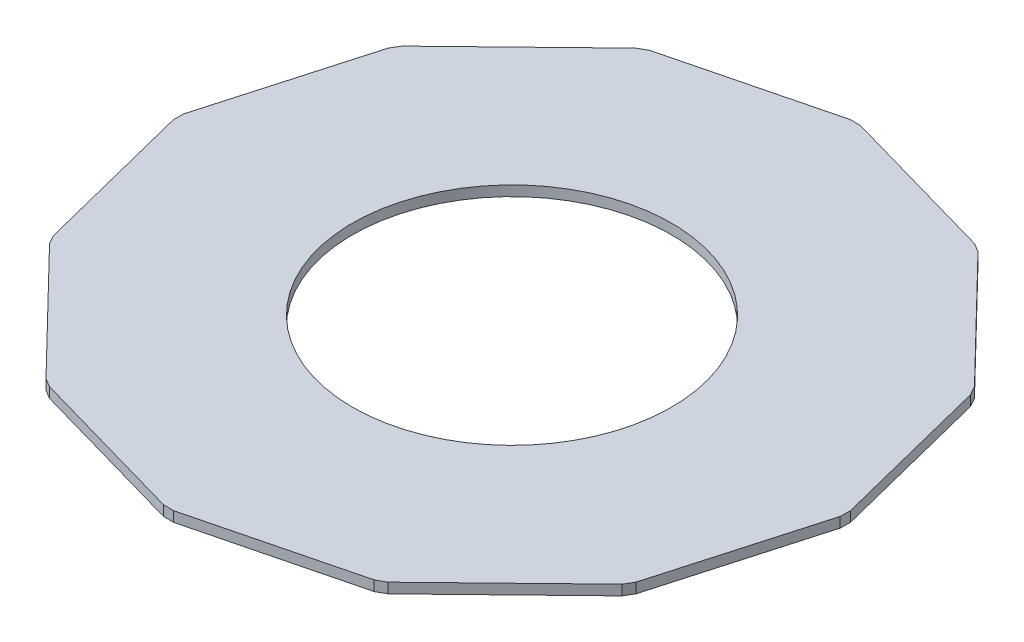
ISO-10303-21;
HEADER;
FILE_DESCRIPTION(('STEP AP214'),'2;1');
FILE_NAME('part.step','',(''),(''),'','','');
FILE_SCHEMA(('AUTOMOTIVE_DESIGN { 1 0 10303 214 1 1 1 1 }'));
ENDSEC;
DATA;
#1=APPLICATION_CONTEXT('core data for automotive mechanical design processes');
#2=APPLICATION_PROTOCOL_DEFINITION('international standard','automotive_design',2000,#1);
#3=PRODUCT_CONTEXT('',#1,'mechanical');
#4=PRODUCT('Part','Part','',(#3));
#5=PRODUCT_RELATED_PRODUCT_CATEGORY('part','',(#4));
#6=PRODUCT_DEFINITION_FORMATION('','',#4);
#7=PRODUCT_DEFINITION_CONTEXT('part definition',#1,'design');
#8=PRODUCT_DEFINITION('design','',#6,#7);
#9=PRODUCT_DEFINITION_SHAPE('','',#8);
#10=(LENGTH_UNIT() NAMED_UNIT(*) SI_UNIT(.MILLI.,.METRE.));
#11=(NAMED_UNIT(*) PLANE_ANGLE_UNIT() SI_UNIT($,.RADIAN.));
#12=(NAMED_UNIT(*) SI_UNIT($,.STERADIAN.) SOLID_ANGLE_UNIT());
#13=UNCERTAINTY_MEASURE_WITH_UNIT(LENGTH_MEASURE(1.E-05),#10,'distance_accuracy_value','');
#14=(GEOMETRIC_REPRESENTATION_CONTEXT(3) GLOBAL_UNCERTAINTY_ASSIGNED_CONTEXT((#13)) GLOBAL_UNIT_ASSIGNED_CONTEXT((#10,
#11,#12)) REPRESENTATION_CONTEXT('',''));
#15=CARTESIAN_POINT('',(0.,0.,0.));
#16=DIRECTION('',(0.,0.,1.));
#17=DIRECTION('',(1.,0.,0.));
#18=AXIS2_PLACEMENT_3D('',#15,#16,#17);
#19=CARTESIAN_POINT('',(0.,3.,0.));
#20=DIRECTION('',(0.,-1.,0.));
#21=DIRECTION('',(0.,0.,-1.));
#22=AXIS2_PLACEMENT_3D('',#19,#20,#21);
#23=PLANE('',#22);
#24=DIRECTION('',(0.4868656215294,0.,0.873476883822801));
#25=VECTOR('',#24,1.);
#26=CARTESIAN_POINT('',(-86.6075627822344,3.,49.9912999323014));
#27=LINE('',#26,#25);
#28=CARTESIAN_POINT('',(-88.0681596468219,3.,47.3708692808343));
#29=VERTEX_POINT('',#28);
#30=CARTESIAN_POINT('',(-86.6075627822344,3.,49.9912999323014));
#31=VERTEX_POINT('',#30);
#32=EDGE_CURVE('E336',#29,#31,#27,.T.);
#33=ORIENTED_EDGE('',*,*,#32,.T.);
#34=DIRECTION('',(0.696348530757659,0.,0.717703785493465));
#35=VECTOR('',#34,1.);
#36=CARTESIAN_POINT('',(-52.5838288782753,3.,85.0584560199646));
#37=LINE('',#36,#35);
#38=CARTESIAN_POINT('',(-52.5838288782753,3.,85.0584560199646));
#39=VERTEX_POINT('',#38);
#40=EDGE_CURVE('E168',#31,#39,#37,.T.);
#41=ORIENTED_EDGE('',*,*,#40,.T.);
#42=DIRECTION('',(0.858376438385156,0.,0.513020360244323));
#43=VECTOR('',#42,1.);
#44=CARTESIAN_POINT('',(-50.0086995631199,3.,86.5975171006976));
#45=LINE('',#44,#43);
#46=CARTESIAN_POINT('',(-50.0086995631199,3.,86.5975171006976));
#47=VERTEX_POINT('',#46);
#48=EDGE_CURVE('E413',#39,#47,#45,.T.);
#49=ORIENTED_EDGE('',*,*,#48,.T.);
#50=DIRECTION('',(0.961907410270835,0.,0.273375445250767));
#51=VECTOR('',#50,1.);
#52=CARTESIAN_POINT('',(-3.00970362685779,3.,99.9546981591085));
#53=LINE('',#52,#51);
#54=CARTESIAN_POINT('',(-3.00970362685779,3.,99.9546981591085));
#55=VERTEX_POINT('',#54);
#56=EDGE_CURVE('E433',#47,#55,#53,.T.);
#57=ORIENTED_EDGE('',*,*,#56,.T.);
#58=DIRECTION('',(0.999885981773714,0.,0.0151004454376491));
#59=VECTOR('',#58,1.);
#60=CARTESIAN_POINT('',(-0.0100456815366456,3.,99.9999994954214));
#61=LINE('',#60,#59);
#62=CARTESIAN_POINT('',(-0.0100456815366456,3.,99.9999994954214));
#63=VERTEX_POINT('',#62);
#64=EDGE_CURVE('E429',#55,#63,#61,.T.);
#65=ORIENTED_EDGE('',*,*,#64,.T.);
#66=DIRECTION('',(0.969723976008427,0.,-0.244203624777373));
#67=VECTOR('',#66,1.);
#68=CARTESIAN_POINT('',(47.3708692808333,3.,88.0681596468224));
#69=LINE('',#68,#67);
#70=CARTESIAN_POINT('',(47.3708692808333,3.,88.0681596468224));
#71=VERTEX_POINT('',#70);
#72=EDGE_CURVE('E432',#63,#71,#69,.T.);
#73=ORIENTED_EDGE('',*,*,#72,.T.);
#74=DIRECTION('',(0.873476883822806,0.,-0.486865621529392));
#75=VECTOR('',#74,1.);
#76=CARTESIAN_POINT('',(49.9912999323017,3.,86.6075627822342));
#77=LINE('',#76,#75);
#78=CARTESIAN_POINT('',(49.9912999323017,3.,86.6075627822342));
#79=VERTEX_POINT('',#78);
#80=EDGE_CURVE('E436',#71,#79,#77,.T.);
#81=ORIENTED_EDGE('',*,*,#80,.T.);
#82=DIRECTION('',(0.717703785493462,0.,-0.696348530757662));
#83=VECTOR('',#82,1.);
#84=CARTESIAN_POINT('',(85.0584560199648,3.,52.583828878275));
#85=LINE('',#84,#83);
#86=CARTESIAN_POINT('',(85.0584560199648,3.,52.583828878275));
#87=VERTEX_POINT('',#86);
#88=EDGE_CURVE('E444',#79,#87,#85,.T.);
#89=ORIENTED_EDGE('',*,*,#88,.T.);
#90=DIRECTION('',(0.513020360244322,0.,-0.858376438385156));
#91=VECTOR('',#90,1.);
#92=CARTESIAN_POINT('',(86.5975171006978,3.,50.0086995631196));
#93=LINE('',#92,#91);
#94=CARTESIAN_POINT('',(86.5975171006978,3.,50.0086995631196));
#95=VERTEX_POINT('',#94);
#96=EDGE_CURVE('E447',#87,#95,#93,.T.);
#97=ORIENTED_EDGE('',*,*,#96,.T.);
#98=DIRECTION('',(0.273375445250764,0.,-0.961907410270836));
#99=VECTOR('',#98,1.);
#100=CARTESIAN_POINT('',(99.9546981591085,3.,3.00970362685742));
#101=LINE('',#100,#99);
#102=CARTESIAN_POINT('',(99.9546981591085,3.,3.00970362685742));
#103=VERTEX_POINT('',#102);
#104=EDGE_CURVE('E450',#95,#103,#101,.T.);
#105=ORIENTED_EDGE('',*,*,#104,.T.);
#106=DIRECTION('',(0.0151004454376491,0.,-0.999885981773714));
#107=VECTOR('',#106,1.);
#108=CARTESIAN_POINT('',(99.9999994954214,3.,0.0100456815362756));
#109=LINE('',#108,#107);
#110=CARTESIAN_POINT('',(99.9999994954214,3.,0.0100456815362756));
#111=VERTEX_POINT('',#110);
#112=EDGE_CURVE('E453',#103,#111,#109,.T.);
#113=ORIENTED_EDGE('',*,*,#112,.T.);
#114=DIRECTION('',(-0.244203624777376,0.,-0.969723976008426));
#115=VECTOR('',#114,1.);
#116=CARTESIAN_POINT('',(88.0681596468223,3.,-47.3708692808336));
#117=LINE('',#116,#115);
#118=CARTESIAN_POINT('',(88.0681596468223,3.,-47.3708692808336));
#119=VERTEX_POINT('',#118);
#120=EDGE_CURVE('E455',#111,#119,#117,.T.);
#121=ORIENTED_EDGE('',*,*,#120,.T.);
#122=DIRECTION('',(-0.486865621529395,0.,-0.873476883822804));
#123=VECTOR('',#122,1.);
#124=CARTESIAN_POINT('',(86.6075627822341,3.,-49.991299932302));
#125=LINE('',#124,#123);
#126=CARTESIAN_POINT('',(86.6075627822341,3.,-49.991299932302));
#127=VERTEX_POINT('',#126);
#128=EDGE_CURVE('E458',#119,#127,#125,.T.);
#129=ORIENTED_EDGE('',*,*,#128,.T.);
#130=DIRECTION('',(-0.696348530757664,0.,-0.71770378549346));
#131=VECTOR('',#130,1.);
#132=CARTESIAN_POINT('',(52.5838288782748,3.,-85.058456019965));
#133=LINE('',#132,#131);
#134=CARTESIAN_POINT('',(52.5838288782748,3.,-85.058456019965));
#135=VERTEX_POINT('',#134);
#136=EDGE_CURVE('E461',#127,#135,#133,.T.);
#137=ORIENTED_EDGE('',*,*,#136,.T.);
#138=DIRECTION('',(-0.858376438385159,0.,-0.513020360244318));
#139=VECTOR('',#138,1.);
#140=CARTESIAN_POINT('',(50.0086995631193,3.,-86.597517100698));
#141=LINE('',#140,#139);
#142=CARTESIAN_POINT('',(50.0086995631193,3.,-86.597517100698));
#143=VERTEX_POINT('',#142);
#144=EDGE_CURVE('E464',#135,#143,#141,.T.);
#145=ORIENTED_EDGE('',*,*,#144,.T.);
#146=DIRECTION('',(-0.961907410270837,0.,-0.27337544525076));
#147=VECTOR('',#146,1.);
#148=CARTESIAN_POINT('',(3.00970362685709,3.,-99.9546981591085));
#149=LINE('',#148,#147);
#150=CARTESIAN_POINT('',(3.00970362685709,3.,-99.9546981591085));
#151=VERTEX_POINT('',#150);
#152=EDGE_CURVE('E466',#143,#151,#149,.T.);
#153=ORIENTED_EDGE('',*,*,#152,.T.);
#154=DIRECTION('',(-0.999885981773714,0.,-0.0151004454376445));
#155=VECTOR('',#154,1.);
#156=CARTESIAN_POINT('',(0.0100456815359403,3.,-99.9999994954214));
#157=LINE('',#156,#155);
#158=CARTESIAN_POINT('',(0.0100456815359403,3.,-99.9999994954214));
#159=VERTEX_POINT('',#158);
#160=EDGE_CURVE('E469',#151,#159,#157,.T.);
#161=ORIENTED_EDGE('',*,*,#160,.T.);
#162=DIRECTION('',(-0.969723976008425,0.,0.244203624777379));
#163=VECTOR('',#162,1.);
#164=CARTESIAN_POINT('',(-47.3708692808339,3.,-88.0681596468221));
#165=LINE('',#164,#163);
#166=CARTESIAN_POINT('',(-47.3708692808339,3.,-88.0681596468221));
#167=VERTEX_POINT('',#166);
#168=EDGE_CURVE('E472',#159,#167,#165,.T.);
#169=ORIENTED_EDGE('',*,*,#168,.T.);
#170=DIRECTION('',(-0.873476883822803,0.,0.486865621529396));
#171=VECTOR('',#170,1.);
#172=CARTESIAN_POINT('',(-49.9912999323023,3.,-86.6075627822339));
#173=LINE('',#172,#171);
#174=CARTESIAN_POINT('',(-49.9912999323023,3.,-86.6075627822339));
#175=VERTEX_POINT('',#174);
#176=EDGE_CURVE('E475',#167,#175,#173,.T.);
#177=ORIENTED_EDGE('',*,*,#176,.T.);
#178=DIRECTION('',(-0.717703785493457,0.,0.696348530757667));
#179=VECTOR('',#178,1.);
#180=CARTESIAN_POINT('',(-85.0584560199652,3.,-52.5838288782744));
#181=LINE('',#180,#179);
#182=CARTESIAN_POINT('',(-85.0584560199652,3.,-52.5838288782744));
#183=VERTEX_POINT('',#182);
#184=EDGE_CURVE('E478',#175,#183,#181,.T.);
#185=ORIENTED_EDGE('',*,*,#184,.T.);
#186=DIRECTION('',(-0.513020360244315,0.,0.858376438385161));
#187=VECTOR('',#186,1.);
#188=CARTESIAN_POINT('',(-86.5975171006981,3.,-50.008699563119));
#189=LINE('',#188,#187);
#190=CARTESIAN_POINT('',(-86.5975171006981,3.,-50.008699563119));
#191=VERTEX_POINT('',#190);
#192=EDGE_CURVE('E250',#183,#191,#189,.T.);
#193=ORIENTED_EDGE('',*,*,#192,.T.);
#194=DIRECTION('',(-0.273375445250757,0.,0.961907410270838));
#195=VECTOR('',#194,1.);
#196=CARTESIAN_POINT('',(-99.9546981591085,3.,-3.00970362685674));
#197=LINE('',#196,#195);
#198=CARTESIAN_POINT('',(-99.9546981591085,3.,-3.00970362685674));
#199=VERTEX_POINT('',#198);
#200=EDGE_CURVE('E244',#191,#199,#197,.T.);
#201=ORIENTED_EDGE('',*,*,#200,.T.);
#202=DIRECTION('',(-0.0151004454376398,0.,0.999885981773714));
#203=VECTOR('',#202,1.);
#204=CARTESIAN_POINT('',(-99.9999994954214,3.,-0.0100456815355912));
#205=LINE('',#204,#203);
#206=CARTESIAN_POINT('',(-99.9999994954214,3.,-0.0100456815355912));
#207=VERTEX_POINT('',#206);
#208=EDGE_CURVE('E248',#199,#207,#205,.T.);
#209=ORIENTED_EDGE('',*,*,#208,.T.);
#210=DIRECTION('',(0.244203624777383,0.,0.969723976008425));
#211=VECTOR('',#210,1.);
#212=CARTESIAN_POINT('',(-88.0681596468219,3.,47.3708692808343));
#213=LINE('',#212,#211);
#214=EDGE_CURVE('E65',#207,#29,#213,.T.);
#215=ORIENTED_EDGE('',*,*,#214,.T.);
#216=EDGE_LOOP('',(#33,#41,#49,#57,#65,#73,#81,#89,#97,#105,#113,#121,#129,#137,#145,#153,#161,
#169,#177,#185,#193,#201,#209,#215));
#217=FACE_BOUND('',#216,.T.);
#218=CARTESIAN_POINT('',(0.,3.,0.));
#219=DIRECTION('',(0.,1.,0.));
#220=DIRECTION('',(0.,0.,1.));
#221=AXIS2_PLACEMENT_3D('',#218,#219,#220);
#222=CIRCLE('',#221,47.1167133191298);
#223=CARTESIAN_POINT('',(0.,3.,47.1167133191298));
#224=VERTEX_POINT('',#223);
#225=EDGE_CURVE('E276',#224,#224,#222,.T.);
#226=ORIENTED_EDGE('',*,*,#225,.F.);
#227=EDGE_LOOP('',(#226));
#228=FACE_BOUND('',#227,.T.);
#229=ADVANCED_FACE('F48',(#217,#228),#23,.F.);
#230=CARTESIAN_POINT('',(0.,0.,0.));
#231=DIRECTION('',(0.,-1.,0.));
#232=DIRECTION('',(0.,0.,-1.));
#233=AXIS2_PLACEMENT_3D('',#230,#231,#232);
#234=PLANE('',#233);
#235=DIRECTION('',(0.4868656215294,0.,0.873476883822801));
#236=VECTOR('',#235,1.);
#237=CARTESIAN_POINT('',(-86.6075627822344,0.,49.9912999323014));
#238=LINE('',#237,#236);
#239=CARTESIAN_POINT('',(-88.0681596468219,0.,47.3708692808343));
#240=VERTEX_POINT('',#239);
#241=CARTESIAN_POINT('',(-86.6075627822344,0.,49.9912999323014));
#242=VERTEX_POINT('',#241);
#243=EDGE_CURVE('E272',#240,#242,#238,.T.);
#244=ORIENTED_EDGE('',*,*,#243,.F.);
#245=DIRECTION('',(0.244203624777383,0.,0.969723976008425));
#246=VECTOR('',#245,1.);
#247=CARTESIAN_POINT('',(-88.0681596468219,0.,47.3708692808343));
#248=LINE('',#247,#246);
#249=CARTESIAN_POINT('',(-99.9999994954214,0.,-0.0100456815355912));
#250=VERTEX_POINT('',#249);
#251=EDGE_CURVE('E160',#250,#240,#248,.T.);
#252=ORIENTED_EDGE('',*,*,#251,.F.);
#253=DIRECTION('',(-0.0151004454376398,0.,0.999885981773714));
#254=VECTOR('',#253,1.);
#255=CARTESIAN_POINT('',(-99.9999994954214,0.,-0.0100456815355912));
#256=LINE('',#255,#254);
#257=CARTESIAN_POINT('',(-99.9546981591085,0.,-3.00970362685674));
#258=VERTEX_POINT('',#257);
#259=EDGE_CURVE('E154',#258,#250,#256,.T.);
#260=ORIENTED_EDGE('',*,*,#259,.F.);
#261=DIRECTION('',(-0.273375445250757,0.,0.961907410270838));
#262=VECTOR('',#261,1.);
#263=CARTESIAN_POINT('',(-99.9546981591085,0.,-3.00970362685674));
#264=LINE('',#263,#262);
#265=CARTESIAN_POINT('',(-86.5975171006981,0.,-50.008699563119));
#266=VERTEX_POINT('',#265);
#267=EDGE_CURVE('E259',#266,#258,#264,.T.);
#268=ORIENTED_EDGE('',*,*,#267,.F.);
#269=DIRECTION('',(-0.513020360244315,0.,0.858376438385161));
#270=VECTOR('',#269,1.);
#271=CARTESIAN_POINT('',(-86.5975171006981,0.,-50.008699563119));
#272=LINE('',#271,#270);
#273=CARTESIAN_POINT('',(-85.0584560199652,0.,-52.5838288782744));
#274=VERTEX_POINT('',#273);
#275=EDGE_CURVE('E330',#274,#266,#272,.T.);
#276=ORIENTED_EDGE('',*,*,#275,.F.);
#277=DIRECTION('',(-0.717703785493457,0.,0.696348530757667));
#278=VECTOR('',#277,1.);
#279=CARTESIAN_POINT('',(-85.0584560199652,0.,-52.5838288782744));
#280=LINE('',#279,#278);
#281=CARTESIAN_POINT('',(-49.9912999323023,0.,-86.6075627822339));
#282=VERTEX_POINT('',#281);
#283=EDGE_CURVE('E327',#282,#274,#280,.T.);
#284=ORIENTED_EDGE('',*,*,#283,.F.);
#285=DIRECTION('',(-0.873476883822803,0.,0.486865621529396));
#286=VECTOR('',#285,1.);
#287=CARTESIAN_POINT('',(-49.9912999323023,0.,-86.6075627822339));
#288=LINE('',#287,#286);
#289=CARTESIAN_POINT('',(-47.3708692808339,0.,-88.0681596468221));
#290=VERTEX_POINT('',#289);
#291=EDGE_CURVE('E324',#290,#282,#288,.T.);
#292=ORIENTED_EDGE('',*,*,#291,.F.);
#293=DIRECTION('',(-0.969723976008425,0.,0.244203624777379));
#294=VECTOR('',#293,1.);
#295=CARTESIAN_POINT('',(-47.3708692808339,0.,-88.0681596468221));
#296=LINE('',#295,#294);
#297=CARTESIAN_POINT('',(0.0100456815359403,0.,-99.9999994954214));
#298=VERTEX_POINT('',#297);
#299=EDGE_CURVE('E321',#298,#290,#296,.T.);
#300=ORIENTED_EDGE('',*,*,#299,.F.);
#301=DIRECTION('',(-0.999885981773714,0.,-0.0151004454376445));
#302=VECTOR('',#301,1.);
#303=CARTESIAN_POINT('',(0.0100456815359403,0.,-99.9999994954214));
#304=LINE('',#303,#302);
#305=CARTESIAN_POINT('',(3.00970362685709,0.,-99.9546981591085));
#306=VERTEX_POINT('',#305);
#307=EDGE_CURVE('E318',#306,#298,#304,.T.);
#308=ORIENTED_EDGE('',*,*,#307,.F.);
#309=DIRECTION('',(-0.961907410270837,0.,-0.27337544525076));
#310=VECTOR('',#309,1.);
#311=CARTESIAN_POINT('',(3.00970362685709,0.,-99.9546981591085));
#312=LINE('',#311,#310);
#313=CARTESIAN_POINT('',(50.0086995631193,0.,-86.597517100698));
#314=VERTEX_POINT('',#313);
#315=EDGE_CURVE('E315',#314,#306,#312,.T.);
#316=ORIENTED_EDGE('',*,*,#315,.F.);
#317=DIRECTION('',(-0.858376438385159,0.,-0.513020360244318));
#318=VECTOR('',#317,1.);
#319=CARTESIAN_POINT('',(50.0086995631193,0.,-86.597517100698));
#320=LINE('',#319,#318);
#321=CARTESIAN_POINT('',(52.5838288782748,0.,-85.058456019965));
#322=VERTEX_POINT('',#321);
#323=EDGE_CURVE('E313',#322,#314,#320,.T.);
#324=ORIENTED_EDGE('',*,*,#323,.F.);
#325=DIRECTION('',(-0.696348530757664,0.,-0.71770378549346));
#326=VECTOR('',#325,1.);
#327=CARTESIAN_POINT('',(52.5838288782748,0.,-85.058456019965));
#328=LINE('',#327,#326);
#329=CARTESIAN_POINT('',(86.6075627822341,0.,-49.991299932302));
#330=VERTEX_POINT('',#329);
#331=EDGE_CURVE('E310',#330,#322,#328,.T.);
#332=ORIENTED_EDGE('',*,*,#331,.F.);
#333=DIRECTION('',(-0.486865621529395,0.,-0.873476883822804));
#334=VECTOR('',#333,1.);
#335=CARTESIAN_POINT('',(86.6075627822341,0.,-49.991299932302));
#336=LINE('',#335,#334);
#337=CARTESIAN_POINT('',(88.0681596468223,0.,-47.3708692808336));
#338=VERTEX_POINT('',#337);
#339=EDGE_CURVE('E307',#338,#330,#336,.T.);
#340=ORIENTED_EDGE('',*,*,#339,.F.);
#341=DIRECTION('',(-0.244203624777376,0.,-0.969723976008426));
#342=VECTOR('',#341,1.);
#343=CARTESIAN_POINT('',(88.0681596468223,0.,-47.3708692808336));
#344=LINE('',#343,#342);
#345=CARTESIAN_POINT('',(99.9999994954214,0.,0.0100456815362756));
#346=VERTEX_POINT('',#345);
#347=EDGE_CURVE('E304',#346,#338,#344,.T.);
#348=ORIENTED_EDGE('',*,*,#347,.F.);
#349=DIRECTION('',(0.0151004454376491,0.,-0.999885981773714));
#350=VECTOR('',#349,1.);
#351=CARTESIAN_POINT('',(99.9999994954214,0.,0.0100456815362756));
#352=LINE('',#351,#350);
#353=CARTESIAN_POINT('',(99.9546981591085,0.,3.00970362685742));
#354=VERTEX_POINT('',#353);
#355=EDGE_CURVE('E302',#354,#346,#352,.T.);
#356=ORIENTED_EDGE('',*,*,#355,.F.);
#357=DIRECTION('',(0.273375445250764,0.,-0.961907410270836));
#358=VECTOR('',#357,1.);
#359=CARTESIAN_POINT('',(99.9546981591085,0.,3.00970362685742));
#360=LINE('',#359,#358);
#361=CARTESIAN_POINT('',(86.5975171006978,0.,50.0086995631196));
#362=VERTEX_POINT('',#361);
#363=EDGE_CURVE('E299',#362,#354,#360,.T.);
#364=ORIENTED_EDGE('',*,*,#363,.F.);
#365=DIRECTION('',(0.513020360244322,0.,-0.858376438385156));
#366=VECTOR('',#365,1.);
#367=CARTESIAN_POINT('',(86.5975171006978,0.,50.0086995631196));
#368=LINE('',#367,#366);
#369=CARTESIAN_POINT('',(85.0584560199648,0.,52.583828878275));
#370=VERTEX_POINT('',#369);
#371=EDGE_CURVE('E296',#370,#362,#368,.T.);
#372=ORIENTED_EDGE('',*,*,#371,.F.);
#373=DIRECTION('',(0.717703785493462,0.,-0.696348530757662));
#374=VECTOR('',#373,1.);
#375=CARTESIAN_POINT('',(85.0584560199648,0.,52.583828878275));
#376=LINE('',#375,#374);
#377=CARTESIAN_POINT('',(49.9912999323017,0.,86.6075627822342));
#378=VERTEX_POINT('',#377);
#379=EDGE_CURVE('E293',#378,#370,#376,.T.);
#380=ORIENTED_EDGE('',*,*,#379,.F.);
#381=DIRECTION('',(0.873476883822806,0.,-0.486865621529392));
#382=VECTOR('',#381,1.);
#383=CARTESIAN_POINT('',(49.9912999323017,0.,86.6075627822342));
#384=LINE('',#383,#382);
#385=CARTESIAN_POINT('',(47.3708692808333,0.,88.0681596468224));
#386=VERTEX_POINT('',#385);
#387=EDGE_CURVE('E290',#386,#378,#384,.T.);
#388=ORIENTED_EDGE('',*,*,#387,.F.);
#389=DIRECTION('',(0.969723976008427,0.,-0.244203624777373));
#390=VECTOR('',#389,1.);
#391=CARTESIAN_POINT('',(47.3708692808333,0.,88.0681596468224));
#392=LINE('',#391,#390);
#393=CARTESIAN_POINT('',(-0.0100456815366456,0.,99.9999994954214));
#394=VERTEX_POINT('',#393);
#395=EDGE_CURVE('E287',#394,#386,#392,.T.);
#396=ORIENTED_EDGE('',*,*,#395,.F.);
#397=DIRECTION('',(0.999885981773714,0.,0.0151004454376491));
#398=VECTOR('',#397,1.);
#399=CARTESIAN_POINT('',(-0.0100456815366456,0.,99.9999994954214));
#400=LINE('',#399,#398);
#401=CARTESIAN_POINT('',(-3.00970362685779,0.,99.9546981591085));
#402=VERTEX_POINT('',#401);
#403=EDGE_CURVE('E284',#402,#394,#400,.T.);
#404=ORIENTED_EDGE('',*,*,#403,.F.);
#405=DIRECTION('',(0.961907410270835,0.,0.273375445250767));
#406=VECTOR('',#405,1.);
#407=CARTESIAN_POINT('',(-3.00970362685779,0.,99.9546981591085));
#408=LINE('',#407,#406);
#409=CARTESIAN_POINT('',(-50.0086995631199,0.,86.5975171006976));
#410=VERTEX_POINT('',#409);
#411=EDGE_CURVE('E281',#410,#402,#408,.T.);
#412=ORIENTED_EDGE('',*,*,#411,.F.);
#413=DIRECTION('',(0.858376438385156,0.,0.513020360244323));
#414=VECTOR('',#413,1.);
#415=CARTESIAN_POINT('',(-50.0086995631199,0.,86.5975171006976));
#416=LINE('',#415,#414);
#417=CARTESIAN_POINT('',(-52.5838288782753,0.,85.0584560199646));
#418=VERTEX_POINT('',#417);
#419=EDGE_CURVE('E279',#418,#410,#416,.T.);
#420=ORIENTED_EDGE('',*,*,#419,.F.);
#421=DIRECTION('',(0.696348530757659,0.,0.717703785493465));
#422=VECTOR('',#421,1.);
#423=CARTESIAN_POINT('',(-52.5838288782753,0.,85.0584560199646));
#424=LINE('',#423,#422);
#425=EDGE_CURVE('E275',#242,#418,#424,.T.);
#426=ORIENTED_EDGE('',*,*,#425,.F.);
#427=EDGE_LOOP('',(#244,#252,#260,#268,#276,#284,#292,#300,#308,#316,#324,#332,#340,#348,#356,
#364,#372,#380,#388,#396,#404,#412,#420,#426));
#428=FACE_BOUND('',#427,.T.);
#429=CARTESIAN_POINT('',(0.,0.,0.));
#430=DIRECTION('',(0.,1.,0.));
#431=DIRECTION('',(0.,0.,1.));
#432=AXIS2_PLACEMENT_3D('',#429,#430,#431);
#433=CIRCLE('',#432,47.1167133191298);
#434=CARTESIAN_POINT('',(0.,0.,47.1167133191298));
#435=VERTEX_POINT('',#434);
#436=EDGE_CURVE('E791',#435,#435,#433,.T.);
#437=ORIENTED_EDGE('',*,*,#436,.T.);
#438=EDGE_LOOP('',(#437));
#439=FACE_BOUND('',#438,.T.);
#440=ADVANCED_FACE('F417',(#428,#439),#234,.T.);
#441=CARTESIAN_POINT('',(-86.6075627822344,3.,49.9912999323014));
#442=DIRECTION('',(0.873476883822801,0.,-0.4868656215294));
#443=DIRECTION('',(-0.4868656215294,0.,-0.873476883822801));
#444=AXIS2_PLACEMENT_3D('',#441,#442,#443);
#445=PLANE('',#444);
#446=ORIENTED_EDGE('',*,*,#243,.T.);
#447=DIRECTION('',(0.,-1.,0.));
#448=VECTOR('',#447,1.);
#449=CARTESIAN_POINT('',(-86.6075627822344,3.,49.9912999323014));
#450=LINE('',#449,#448);
#451=EDGE_CURVE('E13',#31,#242,#450,.T.);
#452=ORIENTED_EDGE('',*,*,#451,.F.);
#453=ORIENTED_EDGE('',*,*,#32,.F.);
#454=DIRECTION('',(0.,-1.,0.));
#455=VECTOR('',#454,1.);
#456=CARTESIAN_POINT('',(-88.0681596468219,3.,47.3708692808343));
#457=LINE('',#456,#455);
#458=EDGE_CURVE('E268',#29,#240,#457,.T.);
#459=ORIENTED_EDGE('',*,*,#458,.T.);
#460=EDGE_LOOP('',(#446,#452,#453,#459));
#461=FACE_BOUND('',#460,.T.);
#462=ADVANCED_FACE('F50',(#461),#445,.F.);
#463=CARTESIAN_POINT('',(-52.5838288782753,3.,85.0584560199646));
#464=DIRECTION('',(0.717703785493465,0.,-0.696348530757659));
#465=DIRECTION('',(-0.696348530757659,0.,-0.717703785493465));
#466=AXIS2_PLACEMENT_3D('',#463,#464,#465);
#467=PLANE('',#466);
#468=ORIENTED_EDGE('',*,*,#425,.T.);
#469=DIRECTION('',(0.,-1.,0.));
#470=VECTOR('',#469,1.);
#471=CARTESIAN_POINT('',(-52.5838288782753,3.,85.0584560199646));
#472=LINE('',#471,#470);
#473=EDGE_CURVE('E57',#39,#418,#472,.T.);
#474=ORIENTED_EDGE('',*,*,#473,.F.);
#475=ORIENTED_EDGE('',*,*,#40,.F.);
#476=ORIENTED_EDGE('',*,*,#451,.T.);
#477=EDGE_LOOP('',(#468,#474,#475,#476));
#478=FACE_BOUND('',#477,.T.);
#479=ADVANCED_FACE('F513',(#478),#467,.F.);
#480=CARTESIAN_POINT('',(-50.0086995631199,3.,86.5975171006976));
#481=DIRECTION('',(0.513020360244323,0.,-0.858376438385156));
#482=DIRECTION('',(-0.858376438385156,0.,-0.513020360244323));
#483=AXIS2_PLACEMENT_3D('',#480,#481,#482);
#484=PLANE('',#483);
#485=ORIENTED_EDGE('',*,*,#419,.T.);
#486=DIRECTION('',(0.,-1.,0.));
#487=VECTOR('',#486,1.);
#488=CARTESIAN_POINT('',(-50.0086995631199,3.,86.5975171006976));
#489=LINE('',#488,#487);
#490=EDGE_CURVE('E403',#47,#410,#489,.T.);
#491=ORIENTED_EDGE('',*,*,#490,.F.);
#492=ORIENTED_EDGE('',*,*,#48,.F.);
#493=ORIENTED_EDGE('',*,*,#473,.T.);
#494=EDGE_LOOP('',(#485,#491,#492,#493));
#495=FACE_BOUND('',#494,.T.);
#496=ADVANCED_FACE('F411',(#495),#484,.F.);
#497=CARTESIAN_POINT('',(-3.00970362685779,3.,99.9546981591085));
#498=DIRECTION('',(0.273375445250767,0.,-0.961907410270835));
#499=DIRECTION('',(-0.961907410270835,0.,-0.273375445250767));
#500=AXIS2_PLACEMENT_3D('',#497,#498,#499);
#501=PLANE('',#500);
#502=ORIENTED_EDGE('',*,*,#411,.T.);
#503=DIRECTION('',(0.,-1.,0.));
#504=VECTOR('',#503,1.);
#505=CARTESIAN_POINT('',(-3.00970362685779,3.,99.9546981591085));
#506=LINE('',#505,#504);
#507=EDGE_CURVE('E399',#55,#402,#506,.T.);
#508=ORIENTED_EDGE('',*,*,#507,.F.);
#509=ORIENTED_EDGE('',*,*,#56,.F.);
#510=ORIENTED_EDGE('',*,*,#490,.T.);
#511=EDGE_LOOP('',(#502,#508,#509,#510));
#512=FACE_BOUND('',#511,.T.);
#513=ADVANCED_FACE('F423',(#512),#501,.F.);
#514=CARTESIAN_POINT('',(-0.0100456815366456,3.,99.9999994954214));
#515=DIRECTION('',(0.0151004454376491,0.,-0.999885981773714));
#516=DIRECTION('',(-0.999885981773714,0.,-0.0151004454376491));
#517=AXIS2_PLACEMENT_3D('',#514,#515,#516);
#518=PLANE('',#517);
#519=ORIENTED_EDGE('',*,*,#403,.T.);
#520=DIRECTION('',(0.,-1.,0.));
#521=VECTOR('',#520,1.);
#522=CARTESIAN_POINT('',(-0.0100456815366456,3.,99.9999994954214));
#523=LINE('',#522,#521);
#524=EDGE_CURVE('E395',#63,#394,#523,.T.);
#525=ORIENTED_EDGE('',*,*,#524,.F.);
#526=ORIENTED_EDGE('',*,*,#64,.F.);
#527=ORIENTED_EDGE('',*,*,#507,.T.);
#528=EDGE_LOOP('',(#519,#525,#526,#527));
#529=FACE_BOUND('',#528,.T.);
#530=ADVANCED_FACE('F427',(#529),#518,.F.);
#531=CARTESIAN_POINT('',(47.3708692808333,3.,88.0681596468224));
#532=DIRECTION('',(-0.244203624777373,0.,-0.969723976008427));
#533=DIRECTION('',(-0.969723976008427,0.,0.244203624777373));
#534=AXIS2_PLACEMENT_3D('',#531,#532,#533);
#535=PLANE('',#534);
#536=ORIENTED_EDGE('',*,*,#395,.T.);
#537=DIRECTION('',(0.,-1.,0.));
#538=VECTOR('',#537,1.);
#539=CARTESIAN_POINT('',(47.3708692808333,3.,88.0681596468224));
#540=LINE('',#539,#538);
#541=EDGE_CURVE('E391',#71,#386,#540,.T.);
#542=ORIENTED_EDGE('',*,*,#541,.F.);
#543=ORIENTED_EDGE('',*,*,#72,.F.);
#544=ORIENTED_EDGE('',*,*,#524,.T.);
#545=EDGE_LOOP('',(#536,#542,#543,#544));
#546=FACE_BOUND('',#545,.T.);
#547=ADVANCED_FACE('F526',(#546),#535,.F.);
#548=CARTESIAN_POINT('',(49.9912999323017,3.,86.6075627822342));
#549=DIRECTION('',(-0.486865621529392,0.,-0.873476883822806));
#550=DIRECTION('',(-0.873476883822806,0.,0.486865621529392));
#551=AXIS2_PLACEMENT_3D('',#548,#549,#550);
#552=PLANE('',#551);
#553=ORIENTED_EDGE('',*,*,#387,.T.);
#554=DIRECTION('',(0.,-1.,0.));
#555=VECTOR('',#554,1.);
#556=CARTESIAN_POINT('',(49.9912999323017,3.,86.6075627822342));
#557=LINE('',#556,#555);
#558=EDGE_CURVE('E387',#79,#378,#557,.T.);
#559=ORIENTED_EDGE('',*,*,#558,.F.);
#560=ORIENTED_EDGE('',*,*,#80,.F.);
#561=ORIENTED_EDGE('',*,*,#541,.T.);
#562=EDGE_LOOP('',(#553,#559,#560,#561));
#563=FACE_BOUND('',#562,.T.);
#564=ADVANCED_FACE('F529',(#563),#552,.F.);
#565=CARTESIAN_POINT('',(85.0584560199648,3.,52.583828878275));
#566=DIRECTION('',(-0.696348530757662,0.,-0.717703785493462));
#567=DIRECTION('',(-0.717703785493462,0.,0.696348530757662));
#568=AXIS2_PLACEMENT_3D('',#565,#566,#567);
#569=PLANE('',#568);
#570=ORIENTED_EDGE('',*,*,#379,.T.);
#571=DIRECTION('',(0.,-1.,0.));
#572=VECTOR('',#571,1.);
#573=CARTESIAN_POINT('',(85.0584560199648,3.,52.583828878275));
#574=LINE('',#573,#572);
#575=EDGE_CURVE('E383',#87,#370,#574,.T.);
#576=ORIENTED_EDGE('',*,*,#575,.F.);
#577=ORIENTED_EDGE('',*,*,#88,.F.);
#578=ORIENTED_EDGE('',*,*,#558,.T.);
#579=EDGE_LOOP('',(#570,#576,#577,#578));
#580=FACE_BOUND('',#579,.T.);
#581=ADVANCED_FACE('F533',(#580),#569,.F.);
#582=CARTESIAN_POINT('',(86.5975171006978,3.,50.0086995631196));
#583=DIRECTION('',(-0.858376438385156,0.,-0.513020360244322));
#584=DIRECTION('',(-0.513020360244322,0.,0.858376438385156));
#585=AXIS2_PLACEMENT_3D('',#582,#583,#584);
#586=PLANE('',#585);
#587=ORIENTED_EDGE('',*,*,#371,.T.);
#588=DIRECTION('',(0.,-1.,0.));
#589=VECTOR('',#588,1.);
#590=CARTESIAN_POINT('',(86.5975171006978,3.,50.0086995631196));
#591=LINE('',#590,#589);
#592=EDGE_CURVE('E379',#95,#362,#591,.T.);
#593=ORIENTED_EDGE('',*,*,#592,.F.);
#594=ORIENTED_EDGE('',*,*,#96,.F.);
#595=ORIENTED_EDGE('',*,*,#575,.T.);
#596=EDGE_LOOP('',(#587,#593,#594,#595));
#597=FACE_BOUND('',#596,.T.);
#598=ADVANCED_FACE('F537',(#597),#586,.F.);
#599=CARTESIAN_POINT('',(99.9546981591085,3.,3.00970362685742));
#600=DIRECTION('',(-0.961907410270836,0.,-0.273375445250764));
#601=DIRECTION('',(-0.273375445250764,0.,0.961907410270836));
#602=AXIS2_PLACEMENT_3D('',#599,#600,#601);
#603=PLANE('',#602);
#604=ORIENTED_EDGE('',*,*,#363,.T.);
#605=DIRECTION('',(0.,-1.,0.));
#606=VECTOR('',#605,1.);
#607=CARTESIAN_POINT('',(99.9546981591085,3.,3.00970362685742));
#608=LINE('',#607,#606);
#609=EDGE_CURVE('E376',#103,#354,#608,.T.);
#610=ORIENTED_EDGE('',*,*,#609,.F.);
#611=ORIENTED_EDGE('',*,*,#104,.F.);
#612=ORIENTED_EDGE('',*,*,#592,.T.);
#613=EDGE_LOOP('',(#604,#610,#611,#612));
#614=FACE_BOUND('',#613,.T.);
#615=ADVANCED_FACE('F541',(#614),#603,.F.);
#616=CARTESIAN_POINT('',(99.9999994954214,3.,0.0100456815362756));
#617=DIRECTION('',(-0.999885981773714,0.,-0.0151004454376491));
#618=DIRECTION('',(-0.0151004454376491,0.,0.999885981773714));
#619=AXIS2_PLACEMENT_3D('',#616,#617,#618);
#620=PLANE('',#619);
#621=ORIENTED_EDGE('',*,*,#355,.T.);
#622=DIRECTION('',(0.,-1.,0.));
#623=VECTOR('',#622,1.);
#624=CARTESIAN_POINT('',(99.9999994954214,3.,0.0100456815362756));
#625=LINE('',#624,#623);
#626=EDGE_CURVE('E373',#111,#346,#625,.T.);
#627=ORIENTED_EDGE('',*,*,#626,.F.);
#628=ORIENTED_EDGE('',*,*,#112,.F.);
#629=ORIENTED_EDGE('',*,*,#609,.T.);
#630=EDGE_LOOP('',(#621,#627,#628,#629));
#631=FACE_BOUND('',#630,.T.);
#632=ADVANCED_FACE('F545',(#631),#620,.F.);
#633=CARTESIAN_POINT('',(88.0681596468223,3.,-47.3708692808336));
#634=DIRECTION('',(-0.969723976008426,0.,0.244203624777376));
#635=DIRECTION('',(0.244203624777376,0.,0.969723976008426));
#636=AXIS2_PLACEMENT_3D('',#633,#634,#635);
#637=PLANE('',#636);
#638=ORIENTED_EDGE('',*,*,#347,.T.);
#639=DIRECTION('',(0.,-1.,0.));
#640=VECTOR('',#639,1.);
#641=CARTESIAN_POINT('',(88.0681596468223,3.,-47.3708692808336));
#642=LINE('',#641,#640);
#643=EDGE_CURVE('E369',#119,#338,#642,.T.);
#644=ORIENTED_EDGE('',*,*,#643,.F.);
#645=ORIENTED_EDGE('',*,*,#120,.F.);
#646=ORIENTED_EDGE('',*,*,#626,.T.);
#647=EDGE_LOOP('',(#638,#644,#645,#646));
#648=FACE_BOUND('',#647,.T.);
#649=ADVANCED_FACE('F549',(#648),#637,.F.);
#650=CARTESIAN_POINT('',(86.6075627822341,3.,-49.991299932302));
#651=DIRECTION('',(-0.873476883822804,0.,0.486865621529395));
#652=DIRECTION('',(0.486865621529395,0.,0.873476883822804));
#653=AXIS2_PLACEMENT_3D('',#650,#651,#652);
#654=PLANE('',#653);
#655=ORIENTED_EDGE('',*,*,#339,.T.);
#656=DIRECTION('',(0.,-1.,0.));
#657=VECTOR('',#656,1.);
#658=CARTESIAN_POINT('',(86.6075627822341,3.,-49.991299932302));
#659=LINE('',#658,#657);
#660=EDGE_CURVE('E365',#127,#330,#659,.T.);
#661=ORIENTED_EDGE('',*,*,#660,.F.);
#662=ORIENTED_EDGE('',*,*,#128,.F.);
#663=ORIENTED_EDGE('',*,*,#643,.T.);
#664=EDGE_LOOP('',(#655,#661,#662,#663));
#665=FACE_BOUND('',#664,.T.);
#666=ADVANCED_FACE('F553',(#665),#654,.F.);
#667=CARTESIAN_POINT('',(52.5838288782748,3.,-85.058456019965));
#668=DIRECTION('',(-0.71770378549346,0.,0.696348530757664));
#669=DIRECTION('',(0.696348530757664,0.,0.71770378549346));
#670=AXIS2_PLACEMENT_3D('',#667,#668,#669);
#671=PLANE('',#670);
#672=ORIENTED_EDGE('',*,*,#331,.T.);
#673=DIRECTION('',(0.,-1.,0.));
#674=VECTOR('',#673,1.);
#675=CARTESIAN_POINT('',(52.5838288782748,3.,-85.058456019965));
#676=LINE('',#675,#674);
#677=EDGE_CURVE('E362',#135,#322,#676,.T.);
#678=ORIENTED_EDGE('',*,*,#677,.F.);
#679=ORIENTED_EDGE('',*,*,#136,.F.);
#680=ORIENTED_EDGE('',*,*,#660,.T.);
#681=EDGE_LOOP('',(#672,#678,#679,#680));
#682=FACE_BOUND('',#681,.T.);
#683=ADVANCED_FACE('F557',(#682),#671,.F.);
#684=CARTESIAN_POINT('',(50.0086995631193,3.,-86.597517100698));
#685=DIRECTION('',(-0.513020360244318,0.,0.858376438385159));
#686=DIRECTION('',(0.858376438385159,0.,0.513020360244318));
#687=AXIS2_PLACEMENT_3D('',#684,#685,#686);
#688=PLANE('',#687);
#689=ORIENTED_EDGE('',*,*,#323,.T.);
#690=DIRECTION('',(0.,-1.,0.));
#691=VECTOR('',#690,1.);
#692=CARTESIAN_POINT('',(50.0086995631193,3.,-86.597517100698));
#693=LINE('',#692,#691);
#694=EDGE_CURVE('E359',#143,#314,#693,.T.);
#695=ORIENTED_EDGE('',*,*,#694,.F.);
#696=ORIENTED_EDGE('',*,*,#144,.F.);
#697=ORIENTED_EDGE('',*,*,#677,.T.);
#698=EDGE_LOOP('',(#689,#695,#696,#697));
#699=FACE_BOUND('',#698,.T.);
#700=ADVANCED_FACE('F561',(#699),#688,.F.);
#701=CARTESIAN_POINT('',(3.00970362685709,3.,-99.9546981591085));
#702=DIRECTION('',(-0.27337544525076,0.,0.961907410270837));
#703=DIRECTION('',(0.961907410270837,0.,0.27337544525076));
#704=AXIS2_PLACEMENT_3D('',#701,#702,#703);
#705=PLANE('',#704);
#706=ORIENTED_EDGE('',*,*,#315,.T.);
#707=DIRECTION('',(0.,-1.,0.));
#708=VECTOR('',#707,1.);
#709=CARTESIAN_POINT('',(3.00970362685709,3.,-99.9546981591085));
#710=LINE('',#709,#708);
#711=EDGE_CURVE('E355',#151,#306,#710,.T.);
#712=ORIENTED_EDGE('',*,*,#711,.F.);
#713=ORIENTED_EDGE('',*,*,#152,.F.);
#714=ORIENTED_EDGE('',*,*,#694,.T.);
#715=EDGE_LOOP('',(#706,#712,#713,#714));
#716=FACE_BOUND('',#715,.T.);
#717=ADVANCED_FACE('F565',(#716),#705,.F.);
#718=CARTESIAN_POINT('',(0.0100456815359403,3.,-99.9999994954214));
#719=DIRECTION('',(-0.0151004454376445,0.,0.999885981773714));
#720=DIRECTION('',(0.999885981773714,0.,0.0151004454376445));
#721=AXIS2_PLACEMENT_3D('',#718,#719,#720);
#722=PLANE('',#721);
#723=ORIENTED_EDGE('',*,*,#307,.T.);
#724=DIRECTION('',(0.,-1.,0.));
#725=VECTOR('',#724,1.);
#726=CARTESIAN_POINT('',(0.0100456815359403,3.,-99.9999994954214));
#727=LINE('',#726,#725);
#728=EDGE_CURVE('E351',#159,#298,#727,.T.);
#729=ORIENTED_EDGE('',*,*,#728,.F.);
#730=ORIENTED_EDGE('',*,*,#160,.F.);
#731=ORIENTED_EDGE('',*,*,#711,.T.);
#732=EDGE_LOOP('',(#723,#729,#730,#731));
#733=FACE_BOUND('',#732,.T.);
#734=ADVANCED_FACE('F569',(#733),#722,.F.);
#735=CARTESIAN_POINT('',(-47.3708692808339,3.,-88.0681596468221));
#736=DIRECTION('',(0.244203624777379,0.,0.969723976008425));
#737=DIRECTION('',(0.969723976008425,0.,-0.244203624777379));
#738=AXIS2_PLACEMENT_3D('',#735,#736,#737);
#739=PLANE('',#738);
#740=ORIENTED_EDGE('',*,*,#299,.T.);
#741=DIRECTION('',(0.,-1.,0.));
#742=VECTOR('',#741,1.);
#743=CARTESIAN_POINT('',(-47.3708692808339,3.,-88.0681596468221));
#744=LINE('',#743,#742);
#745=EDGE_CURVE('E347',#167,#290,#744,.T.);
#746=ORIENTED_EDGE('',*,*,#745,.F.);
#747=ORIENTED_EDGE('',*,*,#168,.F.);
#748=ORIENTED_EDGE('',*,*,#728,.T.);
#749=EDGE_LOOP('',(#740,#746,#747,#748));
#750=FACE_BOUND('',#749,.T.);
#751=ADVANCED_FACE('F573',(#750),#739,.F.);
#752=CARTESIAN_POINT('',(-49.9912999323023,3.,-86.6075627822339));
#753=DIRECTION('',(0.486865621529396,0.,0.873476883822803));
#754=DIRECTION('',(0.873476883822803,0.,-0.486865621529396));
#755=AXIS2_PLACEMENT_3D('',#752,#753,#754);
#756=PLANE('',#755);
#757=ORIENTED_EDGE('',*,*,#291,.T.);
#758=DIRECTION('',(0.,-1.,0.));
#759=VECTOR('',#758,1.);
#760=CARTESIAN_POINT('',(-49.9912999323023,3.,-86.6075627822339));
#761=LINE('',#760,#759);
#762=EDGE_CURVE('E343',#175,#282,#761,.T.);
#763=ORIENTED_EDGE('',*,*,#762,.F.);
#764=ORIENTED_EDGE('',*,*,#176,.F.);
#765=ORIENTED_EDGE('',*,*,#745,.T.);
#766=EDGE_LOOP('',(#757,#763,#764,#765));
#767=FACE_BOUND('',#766,.T.);
#768=ADVANCED_FACE('F577',(#767),#756,.F.);
#769=CARTESIAN_POINT('',(-85.0584560199652,3.,-52.5838288782744));
#770=DIRECTION('',(0.696348530757667,0.,0.717703785493457));
#771=DIRECTION('',(0.717703785493457,0.,-0.696348530757667));
#772=AXIS2_PLACEMENT_3D('',#769,#770,#771);
#773=PLANE('',#772);
#774=ORIENTED_EDGE('',*,*,#283,.T.);
#775=DIRECTION('',(0.,-1.,0.));
#776=VECTOR('',#775,1.);
#777=CARTESIAN_POINT('',(-85.0584560199652,3.,-52.5838288782744));
#778=LINE('',#777,#776);
#779=EDGE_CURVE('E340',#183,#274,#778,.T.);
#780=ORIENTED_EDGE('',*,*,#779,.F.);
#781=ORIENTED_EDGE('',*,*,#184,.F.);
#782=ORIENTED_EDGE('',*,*,#762,.T.);
#783=EDGE_LOOP('',(#774,#780,#781,#782));
#784=FACE_BOUND('',#783,.T.);
#785=ADVANCED_FACE('F485',(#784),#773,.F.);
#786=CARTESIAN_POINT('',(-86.5975171006981,3.,-50.008699563119));
#787=DIRECTION('',(0.858376438385161,0.,0.513020360244315));
#788=DIRECTION('',(0.513020360244315,0.,-0.858376438385161));
#789=AXIS2_PLACEMENT_3D('',#786,#787,#788);
#790=PLANE('',#789);
#791=ORIENTED_EDGE('',*,*,#275,.T.);
#792=DIRECTION('',(0.,-1.,0.));
#793=VECTOR('',#792,1.);
#794=CARTESIAN_POINT('',(-86.5975171006981,3.,-50.008699563119));
#795=LINE('',#794,#793);
#796=EDGE_CURVE('E261',#191,#266,#795,.T.);
#797=ORIENTED_EDGE('',*,*,#796,.F.);
#798=ORIENTED_EDGE('',*,*,#192,.F.);
#799=ORIENTED_EDGE('',*,*,#779,.T.);
#800=EDGE_LOOP('',(#791,#797,#798,#799));
#801=FACE_BOUND('',#800,.T.);
#802=ADVANCED_FACE('F489',(#801),#790,.F.);
#803=CARTESIAN_POINT('',(-99.9546981591085,3.,-3.00970362685674));
#804=DIRECTION('',(0.961907410270838,0.,0.273375445250757));
#805=DIRECTION('',(0.273375445250757,0.,-0.961907410270838));
#806=AXIS2_PLACEMENT_3D('',#803,#804,#805);
#807=PLANE('',#806);
#808=ORIENTED_EDGE('',*,*,#267,.T.);
#809=DIRECTION('',(0.,-1.,0.));
#810=VECTOR('',#809,1.);
#811=CARTESIAN_POINT('',(-99.9546981591085,3.,-3.00970362685674));
#812=LINE('',#811,#810);
#813=EDGE_CURVE('E256',#199,#258,#812,.T.);
#814=ORIENTED_EDGE('',*,*,#813,.F.);
#815=ORIENTED_EDGE('',*,*,#200,.F.);
#816=ORIENTED_EDGE('',*,*,#796,.T.);
#817=EDGE_LOOP('',(#808,#814,#815,#816));
#818=FACE_BOUND('',#817,.T.);
#819=ADVANCED_FACE('F257',(#818),#807,.F.);
#820=CARTESIAN_POINT('',(-99.9999994954214,3.,-0.0100456815355912));
#821=DIRECTION('',(0.999885981773714,0.,0.0151004454376398));
#822=DIRECTION('',(0.0151004454376398,0.,-0.999885981773714));
#823=AXIS2_PLACEMENT_3D('',#820,#821,#822);
#824=PLANE('',#823);
#825=ORIENTED_EDGE('',*,*,#259,.T.);
#826=DIRECTION('',(0.,-1.,0.));
#827=VECTOR('',#826,1.);
#828=CARTESIAN_POINT('',(-99.9999994954214,3.,-0.0100456815355912));
#829=LINE('',#828,#827);
#830=EDGE_CURVE('E262',#207,#250,#829,.T.);
#831=ORIENTED_EDGE('',*,*,#830,.F.);
#832=ORIENTED_EDGE('',*,*,#208,.F.);
#833=ORIENTED_EDGE('',*,*,#813,.T.);
#834=EDGE_LOOP('',(#825,#831,#832,#833));
#835=FACE_BOUND('',#834,.T.);
#836=ADVANCED_FACE('F264',(#835),#824,.F.);
#837=CARTESIAN_POINT('',(-88.0681596468219,3.,47.3708692808343));
#838=DIRECTION('',(0.969723976008424,0.,-0.244203624777383));
#839=DIRECTION('',(-0.244203624777383,0.,-0.969723976008425));
#840=AXIS2_PLACEMENT_3D('',#837,#838,#839);
#841=PLANE('',#840);
#842=ORIENTED_EDGE('',*,*,#251,.T.);
#843=ORIENTED_EDGE('',*,*,#458,.F.);
#844=ORIENTED_EDGE('',*,*,#214,.F.);
#845=ORIENTED_EDGE('',*,*,#830,.T.);
#846=EDGE_LOOP('',(#842,#843,#844,#845));
#847=FACE_BOUND('',#846,.T.);
#848=ADVANCED_FACE('F493',(#847),#841,.F.);
#849=CARTESIAN_POINT('',(0.,3.,0.));
#850=DIRECTION('',(0.,-1.,0.));
#851=DIRECTION('',(0.,0.,-1.));
#852=AXIS2_PLACEMENT_3D('',#849,#850,#851);
#853=CYLINDRICAL_SURFACE('',#852,47.1167133191298);
#854=ORIENTED_EDGE('',*,*,#225,.T.);
#855=EDGE_LOOP('',(#854));
#856=FACE_BOUND('',#855,.T.);
#857=ORIENTED_EDGE('',*,*,#436,.F.);
#858=EDGE_LOOP('',(#857));
#859=FACE_BOUND('',#858,.T.);
#860=ADVANCED_FACE('F495',(#856,#859),#853,.F.);
#861=CLOSED_SHELL('',(#229,#440,#462,#479,#496,#513,#530,#547,#564,#581,#598,#615,#632,#649,
#666,#683,#700,#717,#734,#751,#768,#785,#802,#819,#836,#848,#860));
#862=MANIFOLD_SOLID_BREP('B2',#861);
#863=ADVANCED_BREP_SHAPE_REPRESENTATION('',(#18,#862),#14);
#864=SHAPE_DEFINITION_REPRESENTATION(#9,#863);
ENDSEC;
END-ISO-10303-21;
